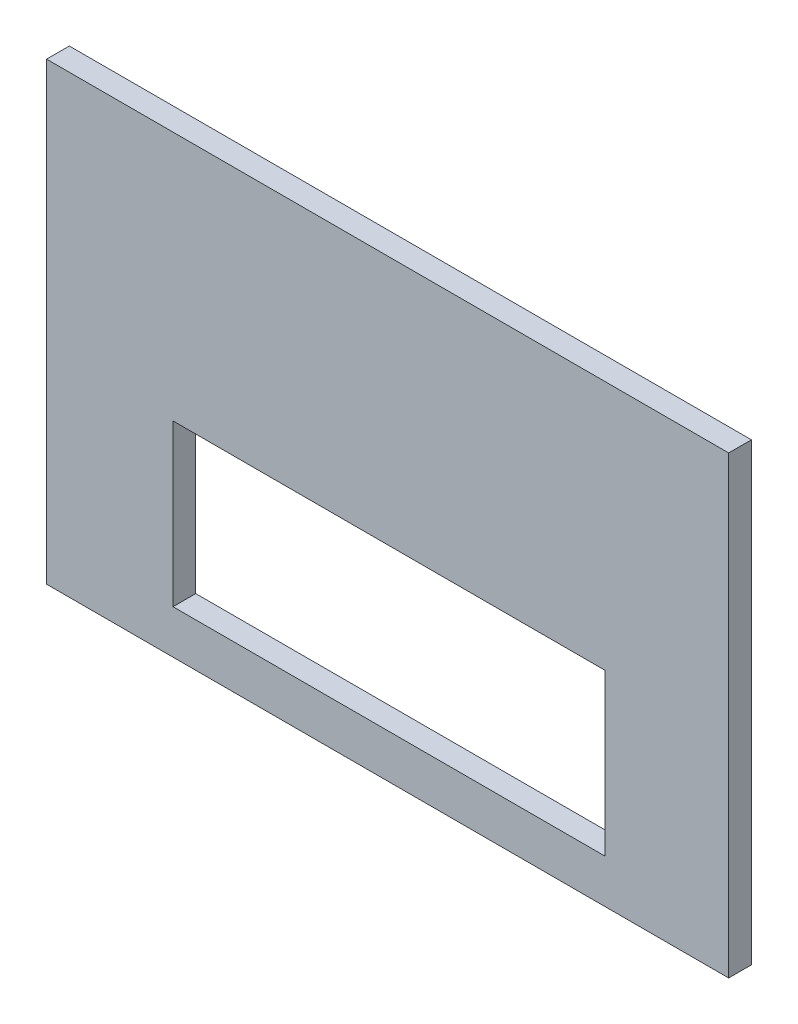
ISO-10303-21;
HEADER;
FILE_DESCRIPTION(('STEP AP214'),'2;1');
FILE_NAME('part.step','',(''),(''),'','','');
FILE_SCHEMA(('AUTOMOTIVE_DESIGN { 1 0 10303 214 1 1 1 1 }'));
ENDSEC;
DATA;
#1=APPLICATION_CONTEXT('core data for automotive mechanical design processes');
#2=APPLICATION_PROTOCOL_DEFINITION('international standard','automotive_design',2000,#1);
#3=PRODUCT_CONTEXT('',#1,'mechanical');
#4=PRODUCT('Part','Part','',(#3));
#5=PRODUCT_RELATED_PRODUCT_CATEGORY('part','',(#4));
#6=PRODUCT_DEFINITION_FORMATION('','',#4);
#7=PRODUCT_DEFINITION_CONTEXT('part definition',#1,'design');
#8=PRODUCT_DEFINITION('design','',#6,#7);
#9=PRODUCT_DEFINITION_SHAPE('','',#8);
#10=(LENGTH_UNIT() NAMED_UNIT(*) SI_UNIT(.MILLI.,.METRE.));
#11=(NAMED_UNIT(*) PLANE_ANGLE_UNIT() SI_UNIT($,.RADIAN.));
#12=(NAMED_UNIT(*) SI_UNIT($,.STERADIAN.) SOLID_ANGLE_UNIT());
#13=UNCERTAINTY_MEASURE_WITH_UNIT(LENGTH_MEASURE(1.E-05),#10,'distance_accuracy_value','');
#14=(GEOMETRIC_REPRESENTATION_CONTEXT(3) GLOBAL_UNCERTAINTY_ASSIGNED_CONTEXT((#13)) GLOBAL_UNIT_ASSIGNED_CONTEXT((#10,
#11,#12)) REPRESENTATION_CONTEXT('',''));
#15=CARTESIAN_POINT('',(0.,0.,0.));
#16=DIRECTION('',(0.,0.,1.));
#17=DIRECTION('',(1.,0.,0.));
#18=AXIS2_PLACEMENT_3D('',#15,#16,#17);
#19=CARTESIAN_POINT('',(0.,0.,10.));
#20=DIRECTION('',(0.,0.,1.));
#21=DIRECTION('',(1.,0.,0.));
#22=AXIS2_PLACEMENT_3D('',#19,#20,#21);
#23=PLANE('',#22);
#24=DIRECTION('',(0.,-1.,0.));
#25=VECTOR('',#24,1.);
#26=CARTESIAN_POINT('',(-15.3846153846154,95.1923076923077,10.));
#27=LINE('',#26,#25);
#28=CARTESIAN_POINT('',(-15.3846153846154,95.1923076923077,10.));
#29=VERTEX_POINT('',#28);
#30=CARTESIAN_POINT('',(-15.3846153846154,-104.807692307692,10.));
#31=VERTEX_POINT('',#30);
#32=EDGE_CURVE('E159',#29,#31,#27,.T.);
#33=ORIENTED_EDGE('',*,*,#32,.T.);
#34=DIRECTION('',(1.,0.,0.));
#35=VECTOR('',#34,1.);
#36=CARTESIAN_POINT('',(-15.3846153846154,-104.807692307692,10.));
#37=LINE('',#36,#35);
#38=CARTESIAN_POINT('',(284.615384615385,-104.807692307692,10.));
#39=VERTEX_POINT('',#38);
#40=EDGE_CURVE('E163',#31,#39,#37,.T.);
#41=ORIENTED_EDGE('',*,*,#40,.T.);
#42=DIRECTION('',(0.,1.,0.));
#43=VECTOR('',#42,1.);
#44=CARTESIAN_POINT('',(284.615384615385,95.1923076923077,10.));
#45=LINE('',#44,#43);
#46=CARTESIAN_POINT('',(284.615384615385,95.1923076923077,10.));
#47=VERTEX_POINT('',#46);
#48=EDGE_CURVE('E167',#39,#47,#45,.T.);
#49=ORIENTED_EDGE('',*,*,#48,.T.);
#50=DIRECTION('',(-1.,0.,0.));
#51=VECTOR('',#50,1.);
#52=CARTESIAN_POINT('',(-15.3846153846154,95.1923076923077,10.));
#53=LINE('',#52,#51);
#54=EDGE_CURVE('E170',#47,#29,#53,.T.);
#55=ORIENTED_EDGE('',*,*,#54,.T.);
#56=EDGE_LOOP('',(#33,#41,#49,#55));
#57=FACE_BOUND('',#56,.T.);
#58=DIRECTION('',(1.,0.,0.));
#59=VECTOR('',#58,1.);
#60=CARTESIAN_POINT('',(40.2197148782332,-85.585178046297,10.));
#61=LINE('',#60,#59);
#62=CARTESIAN_POINT('',(40.2197148782332,-85.585178046297,10.));
#63=VERTEX_POINT('',#62);
#64=CARTESIAN_POINT('',(230.294607936565,-85.585178046297,10.));
#65=VERTEX_POINT('',#64);
#66=EDGE_CURVE('E120',#63,#65,#61,.T.);
#67=ORIENTED_EDGE('',*,*,#66,.F.);
#68=DIRECTION('',(0.,-1.,0.));
#69=VECTOR('',#68,1.);
#70=CARTESIAN_POINT('',(40.2197148782332,-14.8076923076923,10.));
#71=LINE('',#70,#69);
#72=CARTESIAN_POINT('',(40.2197148782332,-14.8076923076923,10.));
#73=VERTEX_POINT('',#72);
#74=EDGE_CURVE('E111',#73,#63,#71,.T.);
#75=ORIENTED_EDGE('',*,*,#74,.F.);
#76=DIRECTION('',(-1.,0.,0.));
#77=VECTOR('',#76,1.);
#78=CARTESIAN_POINT('',(40.2197148782332,-14.8076923076923,10.));
#79=LINE('',#78,#77);
#80=CARTESIAN_POINT('',(230.294607936565,-14.8076923076923,10.));
#81=VERTEX_POINT('',#80);
#82=EDGE_CURVE('E137',#81,#73,#79,.T.);
#83=ORIENTED_EDGE('',*,*,#82,.F.);
#84=DIRECTION('',(0.,1.,0.));
#85=VECTOR('',#84,1.);
#86=CARTESIAN_POINT('',(230.294607936565,-14.8076923076923,10.));
#87=LINE('',#86,#85);
#88=EDGE_CURVE('E133',#65,#81,#87,.T.);
#89=ORIENTED_EDGE('',*,*,#88,.F.);
#90=EDGE_LOOP('',(#67,#75,#83,#89));
#91=FACE_BOUND('',#90,.T.);
#92=ADVANCED_FACE('F45',(#57,#91),#23,.T.);
#93=CARTESIAN_POINT('',(0.,0.,0.));
#94=DIRECTION('',(0.,0.,1.));
#95=DIRECTION('',(1.,0.,0.));
#96=AXIS2_PLACEMENT_3D('',#93,#94,#95);
#97=PLANE('',#96);
#98=DIRECTION('',(0.,-1.,0.));
#99=VECTOR('',#98,1.);
#100=CARTESIAN_POINT('',(-15.3846153846154,95.1923076923077,0.));
#101=LINE('',#100,#99);
#102=CARTESIAN_POINT('',(-15.3846153846154,95.1923076923077,0.));
#103=VERTEX_POINT('',#102);
#104=CARTESIAN_POINT('',(-15.3846153846154,-104.807692307692,0.));
#105=VERTEX_POINT('',#104);
#106=EDGE_CURVE('E129',#103,#105,#101,.T.);
#107=ORIENTED_EDGE('',*,*,#106,.F.);
#108=DIRECTION('',(-1.,0.,0.));
#109=VECTOR('',#108,1.);
#110=CARTESIAN_POINT('',(-15.3846153846154,95.1923076923077,0.));
#111=LINE('',#110,#109);
#112=CARTESIAN_POINT('',(284.615384615385,95.1923076923077,0.));
#113=VERTEX_POINT('',#112);
#114=EDGE_CURVE('E164',#113,#103,#111,.T.);
#115=ORIENTED_EDGE('',*,*,#114,.F.);
#116=DIRECTION('',(0.,1.,0.));
#117=VECTOR('',#116,1.);
#118=CARTESIAN_POINT('',(284.615384615385,95.1923076923077,0.));
#119=LINE('',#118,#117);
#120=CARTESIAN_POINT('',(284.615384615385,-104.807692307692,0.));
#121=VERTEX_POINT('',#120);
#122=EDGE_CURVE('E180',#121,#113,#119,.T.);
#123=ORIENTED_EDGE('',*,*,#122,.F.);
#124=DIRECTION('',(1.,0.,0.));
#125=VECTOR('',#124,1.);
#126=CARTESIAN_POINT('',(-15.3846153846154,-104.807692307692,0.));
#127=LINE('',#126,#125);
#128=EDGE_CURVE('E177',#105,#121,#127,.T.);
#129=ORIENTED_EDGE('',*,*,#128,.F.);
#130=EDGE_LOOP('',(#107,#115,#123,#129));
#131=FACE_BOUND('',#130,.T.);
#132=DIRECTION('',(0.,-1.,0.));
#133=VECTOR('',#132,1.);
#134=CARTESIAN_POINT('',(40.2197148782332,-14.8076923076923,0.));
#135=LINE('',#134,#133);
#136=CARTESIAN_POINT('',(40.2197148782332,-14.8076923076923,0.));
#137=VERTEX_POINT('',#136);
#138=CARTESIAN_POINT('',(40.2197148782332,-85.585178046297,0.));
#139=VERTEX_POINT('',#138);
#140=EDGE_CURVE('E69',#137,#139,#135,.T.);
#141=ORIENTED_EDGE('',*,*,#140,.T.);
#142=DIRECTION('',(1.,0.,0.));
#143=VECTOR('',#142,1.);
#144=CARTESIAN_POINT('',(40.2197148782332,-85.585178046297,0.));
#145=LINE('',#144,#143);
#146=CARTESIAN_POINT('',(230.294607936565,-85.585178046297,0.));
#147=VERTEX_POINT('',#146);
#148=EDGE_CURVE('E127',#139,#147,#145,.T.);
#149=ORIENTED_EDGE('',*,*,#148,.T.);
#150=DIRECTION('',(0.,1.,0.));
#151=VECTOR('',#150,1.);
#152=CARTESIAN_POINT('',(230.294607936565,-14.8076923076923,0.));
#153=LINE('',#152,#151);
#154=CARTESIAN_POINT('',(230.294607936565,-14.8076923076923,0.));
#155=VERTEX_POINT('',#154);
#156=EDGE_CURVE('E146',#147,#155,#153,.T.);
#157=ORIENTED_EDGE('',*,*,#156,.T.);
#158=DIRECTION('',(-1.,0.,0.));
#159=VECTOR('',#158,1.);
#160=CARTESIAN_POINT('',(40.2197148782332,-14.8076923076923,0.));
#161=LINE('',#160,#159);
#162=EDGE_CURVE('E121',#155,#137,#161,.T.);
#163=ORIENTED_EDGE('',*,*,#162,.T.);
#164=EDGE_LOOP('',(#141,#149,#157,#163));
#165=FACE_BOUND('',#164,.T.);
#166=ADVANCED_FACE('F203',(#131,#165),#97,.F.);
#167=CARTESIAN_POINT('',(-15.3846153846154,95.1923076923077,10.));
#168=DIRECTION('',(1.,0.,0.));
#169=DIRECTION('',(0.,1.,0.));
#170=AXIS2_PLACEMENT_3D('',#167,#168,#169);
#171=PLANE('',#170);
#172=ORIENTED_EDGE('',*,*,#106,.T.);
#173=DIRECTION('',(0.,0.,-1.));
#174=VECTOR('',#173,1.);
#175=CARTESIAN_POINT('',(-15.3846153846154,-104.807692307692,10.));
#176=LINE('',#175,#174);
#177=EDGE_CURVE('E11',#31,#105,#176,.T.);
#178=ORIENTED_EDGE('',*,*,#177,.F.);
#179=ORIENTED_EDGE('',*,*,#32,.F.);
#180=DIRECTION('',(0.,0.,-1.));
#181=VECTOR('',#180,1.);
#182=CARTESIAN_POINT('',(-15.3846153846154,95.1923076923077,10.));
#183=LINE('',#182,#181);
#184=EDGE_CURVE('E173',#29,#103,#183,.T.);
#185=ORIENTED_EDGE('',*,*,#184,.T.);
#186=EDGE_LOOP('',(#172,#178,#179,#185));
#187=FACE_BOUND('',#186,.T.);
#188=ADVANCED_FACE('F47',(#187),#171,.F.);
#189=CARTESIAN_POINT('',(-15.3846153846154,-104.807692307692,10.));
#190=DIRECTION('',(0.,1.,0.));
#191=DIRECTION('',(0.,0.,1.));
#192=AXIS2_PLACEMENT_3D('',#189,#190,#191);
#193=PLANE('',#192);
#194=ORIENTED_EDGE('',*,*,#128,.T.);
#195=DIRECTION('',(0.,0.,-1.));
#196=VECTOR('',#195,1.);
#197=CARTESIAN_POINT('',(284.615384615385,-104.807692307692,10.));
#198=LINE('',#197,#196);
#199=EDGE_CURVE('E54',#39,#121,#198,.T.);
#200=ORIENTED_EDGE('',*,*,#199,.F.);
#201=ORIENTED_EDGE('',*,*,#40,.F.);
#202=ORIENTED_EDGE('',*,*,#177,.T.);
#203=EDGE_LOOP('',(#194,#200,#201,#202));
#204=FACE_BOUND('',#203,.T.);
#205=ADVANCED_FACE('F213',(#204),#193,.F.);
#206=CARTESIAN_POINT('',(284.615384615385,95.1923076923077,10.));
#207=DIRECTION('',(-1.,0.,0.));
#208=DIRECTION('',(0.,0.,1.));
#209=AXIS2_PLACEMENT_3D('',#206,#207,#208);
#210=PLANE('',#209);
#211=ORIENTED_EDGE('',*,*,#122,.T.);
#212=DIRECTION('',(0.,0.,-1.));
#213=VECTOR('',#212,1.);
#214=CARTESIAN_POINT('',(284.615384615385,95.1923076923077,10.));
#215=LINE('',#214,#213);
#216=EDGE_CURVE('E188',#47,#113,#215,.T.);
#217=ORIENTED_EDGE('',*,*,#216,.F.);
#218=ORIENTED_EDGE('',*,*,#48,.F.);
#219=ORIENTED_EDGE('',*,*,#199,.T.);
#220=EDGE_LOOP('',(#211,#217,#218,#219));
#221=FACE_BOUND('',#220,.T.);
#222=ADVANCED_FACE('F197',(#221),#210,.F.);
#223=CARTESIAN_POINT('',(-15.3846153846154,95.1923076923077,10.));
#224=DIRECTION('',(0.,-1.,0.));
#225=DIRECTION('',(0.,0.,-1.));
#226=AXIS2_PLACEMENT_3D('',#223,#224,#225);
#227=PLANE('',#226);
#228=ORIENTED_EDGE('',*,*,#114,.T.);
#229=ORIENTED_EDGE('',*,*,#184,.F.);
#230=ORIENTED_EDGE('',*,*,#54,.F.);
#231=ORIENTED_EDGE('',*,*,#216,.T.);
#232=EDGE_LOOP('',(#228,#229,#230,#231));
#233=FACE_BOUND('',#232,.T.);
#234=ADVANCED_FACE('F207',(#233),#227,.F.);
#235=CARTESIAN_POINT('',(40.2197148782332,-14.8076923076923,10.));
#236=DIRECTION('',(1.,0.,0.));
#237=DIRECTION('',(0.,0.,-1.));
#238=AXIS2_PLACEMENT_3D('',#235,#236,#237);
#239=PLANE('',#238);
#240=ORIENTED_EDGE('',*,*,#140,.F.);
#241=DIRECTION('',(0.,0.,-1.));
#242=VECTOR('',#241,1.);
#243=CARTESIAN_POINT('',(40.2197148782332,-14.8076923076923,10.));
#244=LINE('',#243,#242);
#245=EDGE_CURVE('E115',#73,#137,#244,.T.);
#246=ORIENTED_EDGE('',*,*,#245,.F.);
#247=ORIENTED_EDGE('',*,*,#74,.T.);
#248=DIRECTION('',(0.,0.,-1.));
#249=VECTOR('',#248,1.);
#250=CARTESIAN_POINT('',(40.2197148782332,-85.585178046297,10.));
#251=LINE('',#250,#249);
#252=EDGE_CURVE('E114',#63,#139,#251,.T.);
#253=ORIENTED_EDGE('',*,*,#252,.T.);
#254=EDGE_LOOP('',(#240,#246,#247,#253));
#255=FACE_BOUND('',#254,.T.);
#256=ADVANCED_FACE('F113',(#255),#239,.T.);
#257=CARTESIAN_POINT('',(40.2197148782332,-85.585178046297,10.));
#258=DIRECTION('',(0.,1.,0.));
#259=DIRECTION('',(0.,0.,1.));
#260=AXIS2_PLACEMENT_3D('',#257,#258,#259);
#261=PLANE('',#260);
#262=ORIENTED_EDGE('',*,*,#148,.F.);
#263=ORIENTED_EDGE('',*,*,#252,.F.);
#264=ORIENTED_EDGE('',*,*,#66,.T.);
#265=DIRECTION('',(0.,0.,-1.));
#266=VECTOR('',#265,1.);
#267=CARTESIAN_POINT('',(230.294607936565,-85.585178046297,10.));
#268=LINE('',#267,#266);
#269=EDGE_CURVE('E130',#65,#147,#268,.T.);
#270=ORIENTED_EDGE('',*,*,#269,.T.);
#271=EDGE_LOOP('',(#262,#263,#264,#270));
#272=FACE_BOUND('',#271,.T.);
#273=ADVANCED_FACE('F124',(#272),#261,.T.);
#274=CARTESIAN_POINT('',(230.294607936565,-14.8076923076923,10.));
#275=DIRECTION('',(-1.,0.,0.));
#276=DIRECTION('',(0.,0.,1.));
#277=AXIS2_PLACEMENT_3D('',#274,#275,#276);
#278=PLANE('',#277);
#279=ORIENTED_EDGE('',*,*,#156,.F.);
#280=ORIENTED_EDGE('',*,*,#269,.F.);
#281=ORIENTED_EDGE('',*,*,#88,.T.);
#282=DIRECTION('',(0.,0.,-1.));
#283=VECTOR('',#282,1.);
#284=CARTESIAN_POINT('',(230.294607936565,-14.8076923076923,10.));
#285=LINE('',#284,#283);
#286=EDGE_CURVE('E61',#81,#155,#285,.T.);
#287=ORIENTED_EDGE('',*,*,#286,.T.);
#288=EDGE_LOOP('',(#279,#280,#281,#287));
#289=FACE_BOUND('',#288,.T.);
#290=ADVANCED_FACE('F236',(#289),#278,.T.);
#291=CARTESIAN_POINT('',(40.2197148782332,-14.8076923076923,10.));
#292=DIRECTION('',(0.,-1.,0.));
#293=DIRECTION('',(0.,0.,-1.));
#294=AXIS2_PLACEMENT_3D('',#291,#292,#293);
#295=PLANE('',#294);
#296=ORIENTED_EDGE('',*,*,#162,.F.);
#297=ORIENTED_EDGE('',*,*,#286,.F.);
#298=ORIENTED_EDGE('',*,*,#82,.T.);
#299=ORIENTED_EDGE('',*,*,#245,.T.);
#300=EDGE_LOOP('',(#296,#297,#298,#299));
#301=FACE_BOUND('',#300,.T.);
#302=ADVANCED_FACE('F240',(#301),#295,.T.);
#303=CLOSED_SHELL('',(#92,#166,#188,#205,#222,#234,#256,#273,#290,#302));
#304=MANIFOLD_SOLID_BREP('B2',#303);
#305=ADVANCED_BREP_SHAPE_REPRESENTATION('',(#18,#304),#14);
#306=SHAPE_DEFINITION_REPRESENTATION(#9,#305);
ENDSEC;
END-ISO-10303-21;
